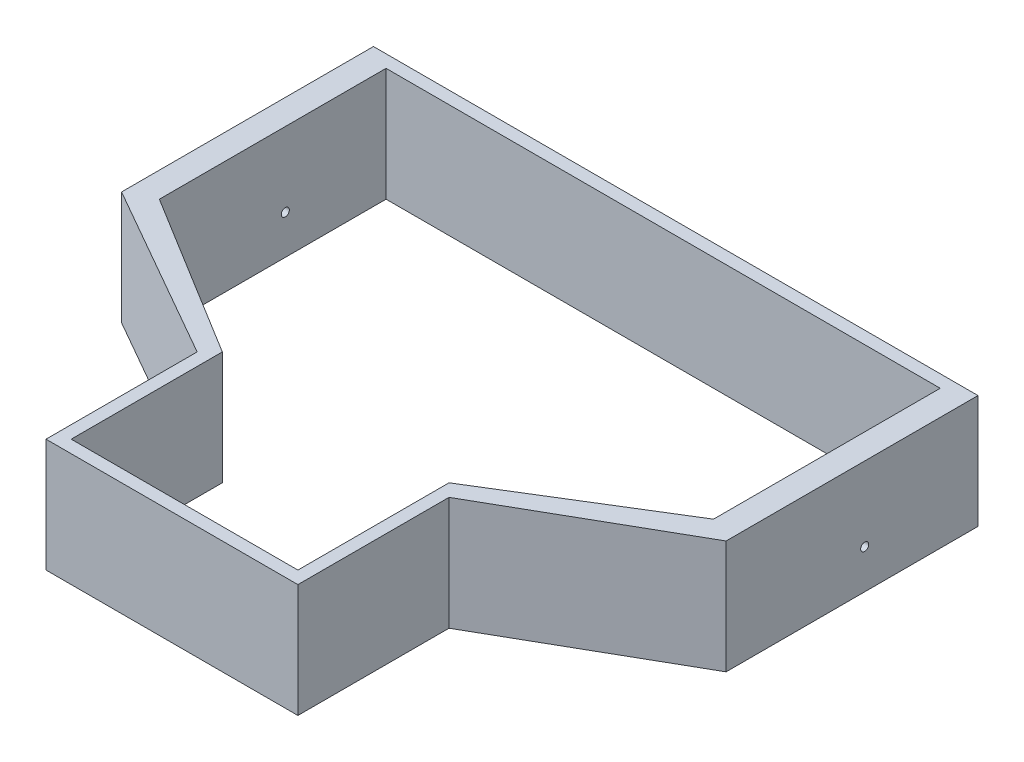
ISO-10303-21;
HEADER;
FILE_DESCRIPTION(('STEP AP214'),'2;1');
FILE_NAME('part.step','',(''),(''),'','','');
FILE_SCHEMA(('AUTOMOTIVE_DESIGN { 1 0 10303 214 1 1 1 1 }'));
ENDSEC;
DATA;
#1=APPLICATION_CONTEXT('core data for automotive mechanical design processes');
#2=APPLICATION_PROTOCOL_DEFINITION('international standard','automotive_design',2000,#1);
#3=PRODUCT_CONTEXT('',#1,'mechanical');
#4=PRODUCT('Part','Part','',(#3));
#5=PRODUCT_RELATED_PRODUCT_CATEGORY('part','',(#4));
#6=PRODUCT_DEFINITION_FORMATION('','',#4);
#7=PRODUCT_DEFINITION_CONTEXT('part definition',#1,'design');
#8=PRODUCT_DEFINITION('design','',#6,#7);
#9=PRODUCT_DEFINITION_SHAPE('','',#8);
#10=(LENGTH_UNIT() NAMED_UNIT(*) SI_UNIT(.MILLI.,.METRE.));
#11=(NAMED_UNIT(*) PLANE_ANGLE_UNIT() SI_UNIT($,.RADIAN.));
#12=(NAMED_UNIT(*) SI_UNIT($,.STERADIAN.) SOLID_ANGLE_UNIT());
#13=UNCERTAINTY_MEASURE_WITH_UNIT(LENGTH_MEASURE(1.E-05),#10,'distance_accuracy_value','');
#14=(GEOMETRIC_REPRESENTATION_CONTEXT(3) GLOBAL_UNCERTAINTY_ASSIGNED_CONTEXT((#13)) GLOBAL_UNIT_ASSIGNED_CONTEXT((#10,
#11,#12)) REPRESENTATION_CONTEXT('',''));
#15=CARTESIAN_POINT('',(0.,0.,0.));
#16=DIRECTION('',(0.,0.,1.));
#17=DIRECTION('',(1.,0.,0.));
#18=AXIS2_PLACEMENT_3D('',#15,#16,#17);
#19=CARTESIAN_POINT('',(-152.4,57.15,127.));
#20=DIRECTION('',(0.496138938356834,0.,-0.868243142124459));
#21=DIRECTION('',(-0.868243142124459,0.,-0.496138938356834));
#22=AXIS2_PLACEMENT_3D('',#19,#20,#21);
#23=PLANE('',#22);
#24=DIRECTION('',(0.868243142124459,0.,0.496138938356834));
#25=VECTOR('',#24,1.);
#26=CARTESIAN_POINT('',(-152.4,0.,127.));
#27=LINE('',#26,#25);
#28=CARTESIAN_POINT('',(-152.4,0.,127.));
#29=VERTEX_POINT('',#28);
#30=CARTESIAN_POINT('',(-63.5,0.,177.8));
#31=VERTEX_POINT('',#30);
#32=EDGE_CURVE('E203',#29,#31,#27,.T.);
#33=ORIENTED_EDGE('',*,*,#32,.T.);
#34=DIRECTION('',(0.,-1.,0.));
#35=VECTOR('',#34,1.);
#36=CARTESIAN_POINT('',(-63.5,57.15,177.8));
#37=LINE('',#36,#35);
#38=CARTESIAN_POINT('',(-63.5,57.15,177.8));
#39=VERTEX_POINT('',#38);
#40=EDGE_CURVE('E11',#39,#31,#37,.T.);
#41=ORIENTED_EDGE('',*,*,#40,.F.);
#42=DIRECTION('',(0.868243142124459,0.,0.496138938356834));
#43=VECTOR('',#42,1.);
#44=CARTESIAN_POINT('',(-152.4,57.15,127.));
#45=LINE('',#44,#43);
#46=CARTESIAN_POINT('',(-152.4,57.15,127.));
#47=VERTEX_POINT('',#46);
#48=EDGE_CURVE('E204',#47,#39,#45,.T.);
#49=ORIENTED_EDGE('',*,*,#48,.F.);
#50=DIRECTION('',(0.,-1.,0.));
#51=VECTOR('',#50,1.);
#52=CARTESIAN_POINT('',(-152.4,57.15,127.));
#53=LINE('',#52,#51);
#54=EDGE_CURVE('E222',#47,#29,#53,.T.);
#55=ORIENTED_EDGE('',*,*,#54,.T.);
#56=EDGE_LOOP('',(#33,#41,#49,#55));
#57=FACE_BOUND('',#56,.T.);
#58=ADVANCED_FACE('F33',(#57),#23,.F.);
#59=CARTESIAN_POINT('',(-63.5,57.15,177.8));
#60=DIRECTION('',(1.,0.,0.));
#61=DIRECTION('',(0.,0.,-1.));
#62=AXIS2_PLACEMENT_3D('',#59,#60,#61);
#63=PLANE('',#62);
#64=DIRECTION('',(0.,0.,1.));
#65=VECTOR('',#64,1.);
#66=CARTESIAN_POINT('',(-63.5,0.,177.8));
#67=LINE('',#66,#65);
#68=CARTESIAN_POINT('',(-63.5,0.,254.));
#69=VERTEX_POINT('',#68);
#70=EDGE_CURVE('E225',#31,#69,#67,.T.);
#71=ORIENTED_EDGE('',*,*,#70,.T.);
#72=DIRECTION('',(0.,-1.,0.));
#73=VECTOR('',#72,1.);
#74=CARTESIAN_POINT('',(-63.5,57.15,254.));
#75=LINE('',#74,#73);
#76=CARTESIAN_POINT('',(-63.5,57.15,254.));
#77=VERTEX_POINT('',#76);
#78=EDGE_CURVE('E41',#77,#69,#75,.T.);
#79=ORIENTED_EDGE('',*,*,#78,.F.);
#80=DIRECTION('',(0.,0.,1.));
#81=VECTOR('',#80,1.);
#82=CARTESIAN_POINT('',(-63.5,57.15,177.8));
#83=LINE('',#82,#81);
#84=EDGE_CURVE('E207',#39,#77,#83,.T.);
#85=ORIENTED_EDGE('',*,*,#84,.F.);
#86=ORIENTED_EDGE('',*,*,#40,.T.);
#87=EDGE_LOOP('',(#71,#79,#85,#86));
#88=FACE_BOUND('',#87,.T.);
#89=ADVANCED_FACE('F281',(#88),#63,.F.);
#90=CARTESIAN_POINT('',(-63.5,57.15,254.));
#91=DIRECTION('',(0.,0.,-1.));
#92=DIRECTION('',(-1.,0.,0.));
#93=AXIS2_PLACEMENT_3D('',#90,#91,#92);
#94=PLANE('',#93);
#95=DIRECTION('',(1.,0.,0.));
#96=VECTOR('',#95,1.);
#97=CARTESIAN_POINT('',(-63.5,0.,254.));
#98=LINE('',#97,#96);
#99=CARTESIAN_POINT('',(63.5000000000001,0.,254.));
#100=VERTEX_POINT('',#99);
#101=EDGE_CURVE('E227',#69,#100,#98,.T.);
#102=ORIENTED_EDGE('',*,*,#101,.T.);
#103=DIRECTION('',(0.,-1.,0.));
#104=VECTOR('',#103,1.);
#105=CARTESIAN_POINT('',(63.5000000000001,57.15,254.));
#106=LINE('',#105,#104);
#107=CARTESIAN_POINT('',(63.5000000000001,57.15,254.));
#108=VERTEX_POINT('',#107);
#109=EDGE_CURVE('E252',#108,#100,#106,.T.);
#110=ORIENTED_EDGE('',*,*,#109,.F.);
#111=DIRECTION('',(1.,0.,0.));
#112=VECTOR('',#111,1.);
#113=CARTESIAN_POINT('',(-63.5,57.15,254.));
#114=LINE('',#113,#112);
#115=EDGE_CURVE('E210',#77,#108,#114,.T.);
#116=ORIENTED_EDGE('',*,*,#115,.F.);
#117=ORIENTED_EDGE('',*,*,#78,.T.);
#118=EDGE_LOOP('',(#102,#110,#116,#117));
#119=FACE_BOUND('',#118,.T.);
#120=ADVANCED_FACE('F260',(#119),#94,.F.);
#121=CARTESIAN_POINT('',(63.5000000000001,57.15,254.));
#122=DIRECTION('',(-1.,0.,0.));
#123=DIRECTION('',(0.,0.,1.));
#124=AXIS2_PLACEMENT_3D('',#121,#122,#123);
#125=PLANE('',#124);
#126=DIRECTION('',(0.,0.,-1.));
#127=VECTOR('',#126,1.);
#128=CARTESIAN_POINT('',(63.5000000000001,0.,254.));
#129=LINE('',#128,#127);
#130=CARTESIAN_POINT('',(63.5000000000001,0.,177.8));
#131=VERTEX_POINT('',#130);
#132=EDGE_CURVE('E229',#100,#131,#129,.T.);
#133=ORIENTED_EDGE('',*,*,#132,.T.);
#134=DIRECTION('',(0.,-1.,0.));
#135=VECTOR('',#134,1.);
#136=CARTESIAN_POINT('',(63.5000000000001,57.15,177.8));
#137=LINE('',#136,#135);
#138=CARTESIAN_POINT('',(63.5000000000001,57.15,177.8));
#139=VERTEX_POINT('',#138);
#140=EDGE_CURVE('E249',#139,#131,#137,.T.);
#141=ORIENTED_EDGE('',*,*,#140,.F.);
#142=DIRECTION('',(0.,0.,-1.));
#143=VECTOR('',#142,1.);
#144=CARTESIAN_POINT('',(63.5000000000001,57.15,254.));
#145=LINE('',#144,#143);
#146=EDGE_CURVE('E212',#108,#139,#145,.T.);
#147=ORIENTED_EDGE('',*,*,#146,.F.);
#148=ORIENTED_EDGE('',*,*,#109,.T.);
#149=EDGE_LOOP('',(#133,#141,#147,#148));
#150=FACE_BOUND('',#149,.T.);
#151=ADVANCED_FACE('F269',(#150),#125,.F.);
#152=CARTESIAN_POINT('',(63.5000000000001,57.15,177.8));
#153=DIRECTION('',(-0.496138938356834,0.,-0.868243142124459));
#154=DIRECTION('',(-0.868243142124459,0.,0.496138938356834));
#155=AXIS2_PLACEMENT_3D('',#152,#153,#154);
#156=PLANE('',#155);
#157=DIRECTION('',(0.868243142124459,0.,-0.496138938356834));
#158=VECTOR('',#157,1.);
#159=CARTESIAN_POINT('',(63.5000000000001,0.,177.8));
#160=LINE('',#159,#158);
#161=CARTESIAN_POINT('',(152.4,0.,127.));
#162=VERTEX_POINT('',#161);
#163=EDGE_CURVE('E231',#131,#162,#160,.T.);
#164=ORIENTED_EDGE('',*,*,#163,.T.);
#165=DIRECTION('',(0.,-1.,0.));
#166=VECTOR('',#165,1.);
#167=CARTESIAN_POINT('',(152.4,57.15,127.));
#168=LINE('',#167,#166);
#169=CARTESIAN_POINT('',(152.4,57.15,127.));
#170=VERTEX_POINT('',#169);
#171=EDGE_CURVE('E246',#170,#162,#168,.T.);
#172=ORIENTED_EDGE('',*,*,#171,.F.);
#173=DIRECTION('',(0.868243142124459,0.,-0.496138938356834));
#174=VECTOR('',#173,1.);
#175=CARTESIAN_POINT('',(63.5000000000001,57.15,177.8));
#176=LINE('',#175,#174);
#177=EDGE_CURVE('E214',#139,#170,#176,.T.);
#178=ORIENTED_EDGE('',*,*,#177,.F.);
#179=ORIENTED_EDGE('',*,*,#140,.T.);
#180=EDGE_LOOP('',(#164,#172,#178,#179));
#181=FACE_BOUND('',#180,.T.);
#182=ADVANCED_FACE('F273',(#181),#156,.F.);
#183=CARTESIAN_POINT('',(152.4,57.15,127.));
#184=DIRECTION('',(-1.,0.,0.));
#185=DIRECTION('',(0.,0.,1.));
#186=AXIS2_PLACEMENT_3D('',#183,#184,#185);
#187=PLANE('',#186);
#188=CARTESIAN_POINT('',(152.4,19.685,57.15));
#189=DIRECTION('',(1.,0.,0.));
#190=DIRECTION('',(0.,0.,-1.));
#191=AXIS2_PLACEMENT_3D('',#188,#189,#190);
#192=CIRCLE('',#191,2.032);
#193=CARTESIAN_POINT('',(152.4,19.685,55.118));
#194=VERTEX_POINT('',#193);
#195=EDGE_CURVE('E458',#194,#194,#192,.T.);
#196=ORIENTED_EDGE('',*,*,#195,.F.);
#197=EDGE_LOOP('',(#196));
#198=FACE_BOUND('',#197,.T.);
#199=DIRECTION('',(0.,0.,-1.));
#200=VECTOR('',#199,1.);
#201=CARTESIAN_POINT('',(152.4,0.,127.));
#202=LINE('',#201,#200);
#203=CARTESIAN_POINT('',(152.4,0.,0.));
#204=VERTEX_POINT('',#203);
#205=EDGE_CURVE('E233',#162,#204,#202,.T.);
#206=ORIENTED_EDGE('',*,*,#205,.T.);
#207=DIRECTION('',(0.,-1.,0.));
#208=VECTOR('',#207,1.);
#209=CARTESIAN_POINT('',(152.4,57.15,0.));
#210=LINE('',#209,#208);
#211=CARTESIAN_POINT('',(152.4,57.15,0.));
#212=VERTEX_POINT('',#211);
#213=EDGE_CURVE('E243',#212,#204,#210,.T.);
#214=ORIENTED_EDGE('',*,*,#213,.F.);
#215=DIRECTION('',(0.,0.,-1.));
#216=VECTOR('',#215,1.);
#217=CARTESIAN_POINT('',(152.4,57.15,127.));
#218=LINE('',#217,#216);
#219=EDGE_CURVE('E216',#170,#212,#218,.T.);
#220=ORIENTED_EDGE('',*,*,#219,.F.);
#221=ORIENTED_EDGE('',*,*,#171,.T.);
#222=EDGE_LOOP('',(#206,#214,#220,#221));
#223=FACE_BOUND('',#222,.T.);
#224=ADVANCED_FACE('F294',(#198,#223),#187,.F.);
#225=CARTESIAN_POINT('',(-152.4,57.15,0.));
#226=DIRECTION('',(0.,0.,1.));
#227=DIRECTION('',(1.,0.,0.));
#228=AXIS2_PLACEMENT_3D('',#225,#226,#227);
#229=PLANE('',#228);
#230=DIRECTION('',(-1.,0.,0.));
#231=VECTOR('',#230,1.);
#232=CARTESIAN_POINT('',(-152.4,0.,0.));
#233=LINE('',#232,#231);
#234=CARTESIAN_POINT('',(-152.4,0.,0.));
#235=VERTEX_POINT('',#234);
#236=EDGE_CURVE('E235',#204,#235,#233,.T.);
#237=ORIENTED_EDGE('',*,*,#236,.T.);
#238=DIRECTION('',(0.,-1.,0.));
#239=VECTOR('',#238,1.);
#240=CARTESIAN_POINT('',(-152.4,57.15,0.));
#241=LINE('',#240,#239);
#242=CARTESIAN_POINT('',(-152.4,57.15,0.));
#243=VERTEX_POINT('',#242);
#244=EDGE_CURVE('E240',#243,#235,#241,.T.);
#245=ORIENTED_EDGE('',*,*,#244,.F.);
#246=DIRECTION('',(-1.,0.,0.));
#247=VECTOR('',#246,1.);
#248=CARTESIAN_POINT('',(-152.4,57.15,0.));
#249=LINE('',#248,#247);
#250=EDGE_CURVE('E218',#212,#243,#249,.T.);
#251=ORIENTED_EDGE('',*,*,#250,.F.);
#252=ORIENTED_EDGE('',*,*,#213,.T.);
#253=EDGE_LOOP('',(#237,#245,#251,#252));
#254=FACE_BOUND('',#253,.T.);
#255=ADVANCED_FACE('F292',(#254),#229,.F.);
#256=CARTESIAN_POINT('',(-152.4,57.15,0.));
#257=DIRECTION('',(1.,0.,0.));
#258=DIRECTION('',(0.,0.,-1.));
#259=AXIS2_PLACEMENT_3D('',#256,#257,#258);
#260=PLANE('',#259);
#261=CARTESIAN_POINT('',(-152.4,19.685,57.15));
#262=DIRECTION('',(1.,0.,0.));
#263=DIRECTION('',(0.,0.,-1.));
#264=AXIS2_PLACEMENT_3D('',#261,#262,#263);
#265=CIRCLE('',#264,2.032);
#266=CARTESIAN_POINT('',(-152.4,19.685,55.118));
#267=VERTEX_POINT('',#266);
#268=EDGE_CURVE('E464',#267,#267,#265,.T.);
#269=ORIENTED_EDGE('',*,*,#268,.T.);
#270=EDGE_LOOP('',(#269));
#271=FACE_BOUND('',#270,.T.);
#272=DIRECTION('',(0.,0.,1.));
#273=VECTOR('',#272,1.);
#274=CARTESIAN_POINT('',(-152.4,0.,0.));
#275=LINE('',#274,#273);
#276=EDGE_CURVE('E208',#235,#29,#275,.T.);
#277=ORIENTED_EDGE('',*,*,#276,.T.);
#278=ORIENTED_EDGE('',*,*,#54,.F.);
#279=DIRECTION('',(0.,0.,1.));
#280=VECTOR('',#279,1.);
#281=CARTESIAN_POINT('',(-152.4,57.15,0.));
#282=LINE('',#281,#280);
#283=EDGE_CURVE('E220',#243,#47,#282,.T.);
#284=ORIENTED_EDGE('',*,*,#283,.F.);
#285=ORIENTED_EDGE('',*,*,#244,.T.);
#286=EDGE_LOOP('',(#277,#278,#284,#285));
#287=FACE_BOUND('',#286,.T.);
#288=ADVANCED_FACE('F287',(#271,#287),#260,.F.);
#289=CARTESIAN_POINT('',(0.,57.15,0.));
#290=DIRECTION('',(0.,-1.,0.));
#291=DIRECTION('',(0.,0.,-1.));
#292=AXIS2_PLACEMENT_3D('',#289,#290,#291);
#293=PLANE('',#292);
#294=DIRECTION('',(0.,0.,-1.));
#295=VECTOR('',#294,1.);
#296=CARTESIAN_POINT('',(57.1500000000001,57.15,247.65));
#297=LINE('',#296,#295);
#298=CARTESIAN_POINT('',(57.1500000000001,57.15,247.65));
#299=VERTEX_POINT('',#298);
#300=CARTESIAN_POINT('',(57.1500000000001,57.15,171.45));
#301=VERTEX_POINT('',#300);
#302=EDGE_CURVE('E479',#299,#301,#297,.T.);
#303=ORIENTED_EDGE('',*,*,#302,.F.);
#304=DIRECTION('',(1.,0.,0.));
#305=VECTOR('',#304,1.);
#306=CARTESIAN_POINT('',(-57.15,57.15,247.65));
#307=LINE('',#306,#305);
#308=CARTESIAN_POINT('',(-57.15,57.15,247.65));
#309=VERTEX_POINT('',#308);
#310=EDGE_CURVE('E163',#309,#299,#307,.T.);
#311=ORIENTED_EDGE('',*,*,#310,.F.);
#312=DIRECTION('',(0.,0.,1.));
#313=VECTOR('',#312,1.);
#314=CARTESIAN_POINT('',(-57.15,57.15,171.45));
#315=LINE('',#314,#313);
#316=CARTESIAN_POINT('',(-57.15,57.15,171.45));
#317=VERTEX_POINT('',#316);
#318=EDGE_CURVE('E175',#317,#309,#315,.T.);
#319=ORIENTED_EDGE('',*,*,#318,.F.);
#320=DIRECTION('',(0.851658316704544,0.,0.524097425664335));
#321=VECTOR('',#320,1.);
#322=CARTESIAN_POINT('',(-139.7,57.15,120.65));
#323=LINE('',#322,#321);
#324=CARTESIAN_POINT('',(-139.7,57.15,120.65));
#325=VERTEX_POINT('',#324);
#326=EDGE_CURVE('E48',#325,#317,#323,.T.);
#327=ORIENTED_EDGE('',*,*,#326,.F.);
#328=DIRECTION('',(0.,0.,1.));
#329=VECTOR('',#328,1.);
#330=CARTESIAN_POINT('',(-139.7,57.15,6.35));
#331=LINE('',#330,#329);
#332=CARTESIAN_POINT('',(-139.7,57.15,6.35));
#333=VERTEX_POINT('',#332);
#334=EDGE_CURVE('E171',#333,#325,#331,.T.);
#335=ORIENTED_EDGE('',*,*,#334,.F.);
#336=DIRECTION('',(-1.,0.,0.));
#337=VECTOR('',#336,1.);
#338=CARTESIAN_POINT('',(-139.7,57.15,6.35));
#339=LINE('',#338,#337);
#340=CARTESIAN_POINT('',(139.7,57.15,6.34999999999995));
#341=VERTEX_POINT('',#340);
#342=EDGE_CURVE('E470',#341,#333,#339,.T.);
#343=ORIENTED_EDGE('',*,*,#342,.F.);
#344=DIRECTION('',(0.,0.,-1.));
#345=VECTOR('',#344,1.);
#346=CARTESIAN_POINT('',(139.7,57.15,120.65));
#347=LINE('',#346,#345);
#348=CARTESIAN_POINT('',(139.7,57.15,120.65));
#349=VERTEX_POINT('',#348);
#350=EDGE_CURVE('E473',#349,#341,#347,.T.);
#351=ORIENTED_EDGE('',*,*,#350,.F.);
#352=DIRECTION('',(0.851658316704544,0.,-0.524097425664335));
#353=VECTOR('',#352,1.);
#354=CARTESIAN_POINT('',(57.1500000000001,57.15,171.45));
#355=LINE('',#354,#353);
#356=EDGE_CURVE('E476',#301,#349,#355,.T.);
#357=ORIENTED_EDGE('',*,*,#356,.F.);
#358=EDGE_LOOP('',(#303,#311,#319,#327,#335,#343,#351,#357));
#359=FACE_BOUND('',#358,.T.);
#360=ORIENTED_EDGE('',*,*,#48,.T.);
#361=ORIENTED_EDGE('',*,*,#84,.T.);
#362=ORIENTED_EDGE('',*,*,#115,.T.);
#363=ORIENTED_EDGE('',*,*,#146,.T.);
#364=ORIENTED_EDGE('',*,*,#177,.T.);
#365=ORIENTED_EDGE('',*,*,#219,.T.);
#366=ORIENTED_EDGE('',*,*,#250,.T.);
#367=ORIENTED_EDGE('',*,*,#283,.T.);
#368=EDGE_LOOP('',(#360,#361,#362,#363,#364,#365,#366,#367));
#369=FACE_BOUND('',#368,.T.);
#370=ADVANCED_FACE('F277',(#359,#369),#293,.F.);
#371=CARTESIAN_POINT('',(0.,0.,0.));
#372=DIRECTION('',(0.,-1.,0.));
#373=DIRECTION('',(0.,0.,-1.));
#374=AXIS2_PLACEMENT_3D('',#371,#372,#373);
#375=PLANE('',#374);
#376=DIRECTION('',(1.,0.,0.));
#377=VECTOR('',#376,1.);
#378=CARTESIAN_POINT('',(-57.15,0.,247.65));
#379=LINE('',#378,#377);
#380=CARTESIAN_POINT('',(-57.15,0.,247.65));
#381=VERTEX_POINT('',#380);
#382=CARTESIAN_POINT('',(57.1500000000001,0.,247.65));
#383=VERTEX_POINT('',#382);
#384=EDGE_CURVE('E160',#381,#383,#379,.T.);
#385=ORIENTED_EDGE('',*,*,#384,.T.);
#386=DIRECTION('',(0.,0.,-1.));
#387=VECTOR('',#386,1.);
#388=CARTESIAN_POINT('',(57.1500000000001,0.,247.65));
#389=LINE('',#388,#387);
#390=CARTESIAN_POINT('',(57.1500000000001,0.,171.45));
#391=VERTEX_POINT('',#390);
#392=EDGE_CURVE('E147',#383,#391,#389,.T.);
#393=ORIENTED_EDGE('',*,*,#392,.T.);
#394=DIRECTION('',(0.851658316704544,0.,-0.524097425664335));
#395=VECTOR('',#394,1.);
#396=CARTESIAN_POINT('',(57.1500000000001,0.,171.45));
#397=LINE('',#396,#395);
#398=CARTESIAN_POINT('',(139.7,0.,120.65));
#399=VERTEX_POINT('',#398);
#400=EDGE_CURVE('E194',#391,#399,#397,.T.);
#401=ORIENTED_EDGE('',*,*,#400,.T.);
#402=DIRECTION('',(0.,0.,-1.));
#403=VECTOR('',#402,1.);
#404=CARTESIAN_POINT('',(139.7,0.,120.65));
#405=LINE('',#404,#403);
#406=CARTESIAN_POINT('',(139.7,0.,6.34999999999995));
#407=VERTEX_POINT('',#406);
#408=EDGE_CURVE('E190',#399,#407,#405,.T.);
#409=ORIENTED_EDGE('',*,*,#408,.T.);
#410=DIRECTION('',(-1.,0.,0.));
#411=VECTOR('',#410,1.);
#412=CARTESIAN_POINT('',(-139.7,0.,6.35));
#413=LINE('',#412,#411);
#414=CARTESIAN_POINT('',(-139.7,0.,6.35));
#415=VERTEX_POINT('',#414);
#416=EDGE_CURVE('E186',#407,#415,#413,.T.);
#417=ORIENTED_EDGE('',*,*,#416,.T.);
#418=DIRECTION('',(0.,0.,1.));
#419=VECTOR('',#418,1.);
#420=CARTESIAN_POINT('',(-139.7,0.,6.35));
#421=LINE('',#420,#419);
#422=CARTESIAN_POINT('',(-139.7,0.,120.65));
#423=VERTEX_POINT('',#422);
#424=EDGE_CURVE('E182',#415,#423,#421,.T.);
#425=ORIENTED_EDGE('',*,*,#424,.T.);
#426=DIRECTION('',(0.851658316704544,0.,0.524097425664335));
#427=VECTOR('',#426,1.);
#428=CARTESIAN_POINT('',(-139.7,0.,120.65));
#429=LINE('',#428,#427);
#430=CARTESIAN_POINT('',(-57.15,0.,171.45));
#431=VERTEX_POINT('',#430);
#432=EDGE_CURVE('E179',#423,#431,#429,.T.);
#433=ORIENTED_EDGE('',*,*,#432,.T.);
#434=DIRECTION('',(0.,0.,1.));
#435=VECTOR('',#434,1.);
#436=CARTESIAN_POINT('',(-57.15,0.,171.45));
#437=LINE('',#436,#435);
#438=EDGE_CURVE('E169',#431,#381,#437,.T.);
#439=ORIENTED_EDGE('',*,*,#438,.T.);
#440=EDGE_LOOP('',(#385,#393,#401,#409,#417,#425,#433,#439));
#441=FACE_BOUND('',#440,.T.);
#442=ORIENTED_EDGE('',*,*,#32,.F.);
#443=ORIENTED_EDGE('',*,*,#276,.F.);
#444=ORIENTED_EDGE('',*,*,#236,.F.);
#445=ORIENTED_EDGE('',*,*,#205,.F.);
#446=ORIENTED_EDGE('',*,*,#163,.F.);
#447=ORIENTED_EDGE('',*,*,#132,.F.);
#448=ORIENTED_EDGE('',*,*,#101,.F.);
#449=ORIENTED_EDGE('',*,*,#70,.F.);
#450=EDGE_LOOP('',(#442,#443,#444,#445,#446,#447,#448,#449));
#451=FACE_BOUND('',#450,.T.);
#452=ADVANCED_FACE('F166',(#441,#451),#375,.T.);
#453=CARTESIAN_POINT('',(-57.15,-369.174823085215,247.65));
#454=DIRECTION('',(0.,0.,1.));
#455=DIRECTION('',(1.,0.,0.));
#456=AXIS2_PLACEMENT_3D('',#453,#454,#455);
#457=PLANE('',#456);
#458=DIRECTION('',(0.,1.,0.));
#459=VECTOR('',#458,1.);
#460=CARTESIAN_POINT('',(-57.15,-369.174823085215,247.65));
#461=LINE('',#460,#459);
#462=EDGE_CURVE('E56',#381,#309,#461,.T.);
#463=ORIENTED_EDGE('',*,*,#462,.T.);
#464=ORIENTED_EDGE('',*,*,#310,.T.);
#465=DIRECTION('',(0.,1.,0.));
#466=VECTOR('',#465,1.);
#467=CARTESIAN_POINT('',(57.1500000000001,-369.174823085215,247.65));
#468=LINE('',#467,#466);
#469=EDGE_CURVE('E151',#383,#299,#468,.T.);
#470=ORIENTED_EDGE('',*,*,#469,.F.);
#471=ORIENTED_EDGE('',*,*,#384,.F.);
#472=EDGE_LOOP('',(#463,#464,#470,#471));
#473=FACE_BOUND('',#472,.T.);
#474=ADVANCED_FACE('F159',(#473),#457,.F.);
#475=CARTESIAN_POINT('',(57.1500000000001,-369.174823085215,247.65));
#476=DIRECTION('',(1.,0.,0.));
#477=DIRECTION('',(0.,0.,-1.));
#478=AXIS2_PLACEMENT_3D('',#475,#476,#477);
#479=PLANE('',#478);
#480=ORIENTED_EDGE('',*,*,#469,.T.);
#481=ORIENTED_EDGE('',*,*,#302,.T.);
#482=DIRECTION('',(0.,1.,0.));
#483=VECTOR('',#482,1.);
#484=CARTESIAN_POINT('',(57.1500000000001,-369.174823085215,171.45));
#485=LINE('',#484,#483);
#486=EDGE_CURVE('E153',#391,#301,#485,.T.);
#487=ORIENTED_EDGE('',*,*,#486,.F.);
#488=ORIENTED_EDGE('',*,*,#392,.F.);
#489=EDGE_LOOP('',(#480,#481,#487,#488));
#490=FACE_BOUND('',#489,.T.);
#491=ADVANCED_FACE('F149',(#490),#479,.F.);
#492=CARTESIAN_POINT('',(57.1500000000001,-369.174823085215,171.45));
#493=DIRECTION('',(0.524097425664335,0.,0.851658316704544));
#494=DIRECTION('',(0.851658316704544,0.,-0.524097425664335));
#495=AXIS2_PLACEMENT_3D('',#492,#493,#494);
#496=PLANE('',#495);
#497=ORIENTED_EDGE('',*,*,#486,.T.);
#498=ORIENTED_EDGE('',*,*,#356,.T.);
#499=DIRECTION('',(0.,1.,0.));
#500=VECTOR('',#499,1.);
#501=CARTESIAN_POINT('',(139.7,-369.174823085215,120.65));
#502=LINE('',#501,#500);
#503=EDGE_CURVE('E193',#399,#349,#502,.T.);
#504=ORIENTED_EDGE('',*,*,#503,.F.);
#505=ORIENTED_EDGE('',*,*,#400,.F.);
#506=EDGE_LOOP('',(#497,#498,#504,#505));
#507=FACE_BOUND('',#506,.T.);
#508=ADVANCED_FACE('F366',(#507),#496,.F.);
#509=CARTESIAN_POINT('',(139.7,-369.174823085215,120.65));
#510=DIRECTION('',(1.,0.,0.));
#511=DIRECTION('',(0.,0.,-1.));
#512=AXIS2_PLACEMENT_3D('',#509,#510,#511);
#513=PLANE('',#512);
#514=CARTESIAN_POINT('',(139.7,19.685,57.15));
#515=DIRECTION('',(1.,0.,0.));
#516=DIRECTION('',(0.,0.,-1.));
#517=AXIS2_PLACEMENT_3D('',#514,#515,#516);
#518=CIRCLE('',#517,2.032);
#519=CARTESIAN_POINT('',(139.7,19.685,55.118));
#520=VERTEX_POINT('',#519);
#521=EDGE_CURVE('E461',#520,#520,#518,.T.);
#522=ORIENTED_EDGE('',*,*,#521,.T.);
#523=EDGE_LOOP('',(#522));
#524=FACE_BOUND('',#523,.T.);
#525=ORIENTED_EDGE('',*,*,#503,.T.);
#526=ORIENTED_EDGE('',*,*,#350,.T.);
#527=DIRECTION('',(0.,1.,0.));
#528=VECTOR('',#527,1.);
#529=CARTESIAN_POINT('',(139.7,-369.174823085215,6.34999999999995));
#530=LINE('',#529,#528);
#531=EDGE_CURVE('E189',#407,#341,#530,.T.);
#532=ORIENTED_EDGE('',*,*,#531,.F.);
#533=ORIENTED_EDGE('',*,*,#408,.F.);
#534=EDGE_LOOP('',(#525,#526,#532,#533));
#535=FACE_BOUND('',#534,.T.);
#536=ADVANCED_FACE('F375',(#524,#535),#513,.F.);
#537=CARTESIAN_POINT('',(-139.7,-369.174823085215,6.35));
#538=DIRECTION('',(0.,0.,-1.));
#539=DIRECTION('',(-1.,0.,0.));
#540=AXIS2_PLACEMENT_3D('',#537,#538,#539);
#541=PLANE('',#540);
#542=ORIENTED_EDGE('',*,*,#531,.T.);
#543=ORIENTED_EDGE('',*,*,#342,.T.);
#544=DIRECTION('',(0.,1.,0.));
#545=VECTOR('',#544,1.);
#546=CARTESIAN_POINT('',(-139.7,-369.174823085215,6.35));
#547=LINE('',#546,#545);
#548=EDGE_CURVE('E185',#415,#333,#547,.T.);
#549=ORIENTED_EDGE('',*,*,#548,.F.);
#550=ORIENTED_EDGE('',*,*,#416,.F.);
#551=EDGE_LOOP('',(#542,#543,#549,#550));
#552=FACE_BOUND('',#551,.T.);
#553=ADVANCED_FACE('F383',(#552),#541,.F.);
#554=CARTESIAN_POINT('',(-139.7,-369.174823085215,6.35));
#555=DIRECTION('',(-1.,0.,0.));
#556=DIRECTION('',(0.,0.,1.));
#557=AXIS2_PLACEMENT_3D('',#554,#555,#556);
#558=PLANE('',#557);
#559=CARTESIAN_POINT('',(-139.7,19.685,57.15));
#560=DIRECTION('',(-1.,0.,0.));
#561=DIRECTION('',(0.,0.,1.));
#562=AXIS2_PLACEMENT_3D('',#559,#560,#561);
#563=CIRCLE('',#562,2.032);
#564=CARTESIAN_POINT('',(-139.7,19.685,59.182));
#565=VERTEX_POINT('',#564);
#566=EDGE_CURVE('E36',#565,#565,#563,.T.);
#567=ORIENTED_EDGE('',*,*,#566,.T.);
#568=EDGE_LOOP('',(#567));
#569=FACE_BOUND('',#568,.T.);
#570=ORIENTED_EDGE('',*,*,#548,.T.);
#571=ORIENTED_EDGE('',*,*,#334,.T.);
#572=DIRECTION('',(0.,1.,0.));
#573=VECTOR('',#572,1.);
#574=CARTESIAN_POINT('',(-139.7,-369.174823085215,120.65));
#575=LINE('',#574,#573);
#576=EDGE_CURVE('E181',#423,#325,#575,.T.);
#577=ORIENTED_EDGE('',*,*,#576,.F.);
#578=ORIENTED_EDGE('',*,*,#424,.F.);
#579=EDGE_LOOP('',(#570,#571,#577,#578));
#580=FACE_BOUND('',#579,.T.);
#581=ADVANCED_FACE('F388',(#569,#580),#558,.F.);
#582=CARTESIAN_POINT('',(-139.7,-369.174823085215,120.65));
#583=DIRECTION('',(-0.524097425664335,0.,0.851658316704544));
#584=DIRECTION('',(0.851658316704544,0.,0.524097425664335));
#585=AXIS2_PLACEMENT_3D('',#582,#583,#584);
#586=PLANE('',#585);
#587=ORIENTED_EDGE('',*,*,#576,.T.);
#588=ORIENTED_EDGE('',*,*,#326,.T.);
#589=DIRECTION('',(0.,1.,0.));
#590=VECTOR('',#589,1.);
#591=CARTESIAN_POINT('',(-57.15,-369.174823085215,171.45));
#592=LINE('',#591,#590);
#593=EDGE_CURVE('E178',#431,#317,#592,.T.);
#594=ORIENTED_EDGE('',*,*,#593,.F.);
#595=ORIENTED_EDGE('',*,*,#432,.F.);
#596=EDGE_LOOP('',(#587,#588,#594,#595));
#597=FACE_BOUND('',#596,.T.);
#598=ADVANCED_FACE('F396',(#597),#586,.F.);
#599=CARTESIAN_POINT('',(-57.15,-369.174823085215,171.45));
#600=DIRECTION('',(-1.,0.,0.));
#601=DIRECTION('',(0.,0.,1.));
#602=AXIS2_PLACEMENT_3D('',#599,#600,#601);
#603=PLANE('',#602);
#604=ORIENTED_EDGE('',*,*,#593,.T.);
#605=ORIENTED_EDGE('',*,*,#318,.T.);
#606=ORIENTED_EDGE('',*,*,#462,.F.);
#607=ORIENTED_EDGE('',*,*,#438,.F.);
#608=EDGE_LOOP('',(#604,#605,#606,#607));
#609=FACE_BOUND('',#608,.T.);
#610=ADVANCED_FACE('F401',(#609),#603,.F.);
#611=CARTESIAN_POINT('',(-152.4,19.685,57.15));
#612=DIRECTION('',(1.,0.,0.));
#613=DIRECTION('',(0.,0.,-1.));
#614=AXIS2_PLACEMENT_3D('',#611,#612,#613);
#615=CYLINDRICAL_SURFACE('',#614,2.032);
#616=ORIENTED_EDGE('',*,*,#268,.F.);
#617=EDGE_LOOP('',(#616));
#618=FACE_BOUND('',#617,.T.);
#619=ORIENTED_EDGE('',*,*,#566,.F.);
#620=EDGE_LOOP('',(#619));
#621=FACE_BOUND('',#620,.T.);
#622=ADVANCED_FACE('F409',(#618,#621),#615,.F.);
#623=ORIENTED_EDGE('',*,*,#195,.T.);
#624=EDGE_LOOP('',(#623));
#625=FACE_BOUND('',#624,.T.);
#626=ORIENTED_EDGE('',*,*,#521,.F.);
#627=EDGE_LOOP('',(#626));
#628=FACE_BOUND('',#627,.T.);
#629=ADVANCED_FACE('F443',(#625,#628),#615,.F.);
#630=CLOSED_SHELL('',(#58,#89,#120,#151,#182,#224,#255,#288,#370,#452,#474,#491,#508,#536,#553,
#581,#598,#610,#622,#629));
#631=MANIFOLD_SOLID_BREP('B2',#630);
#632=ADVANCED_BREP_SHAPE_REPRESENTATION('',(#18,#631),#14);
#633=SHAPE_DEFINITION_REPRESENTATION(#9,#632);
ENDSEC;
END-ISO-10303-21;
